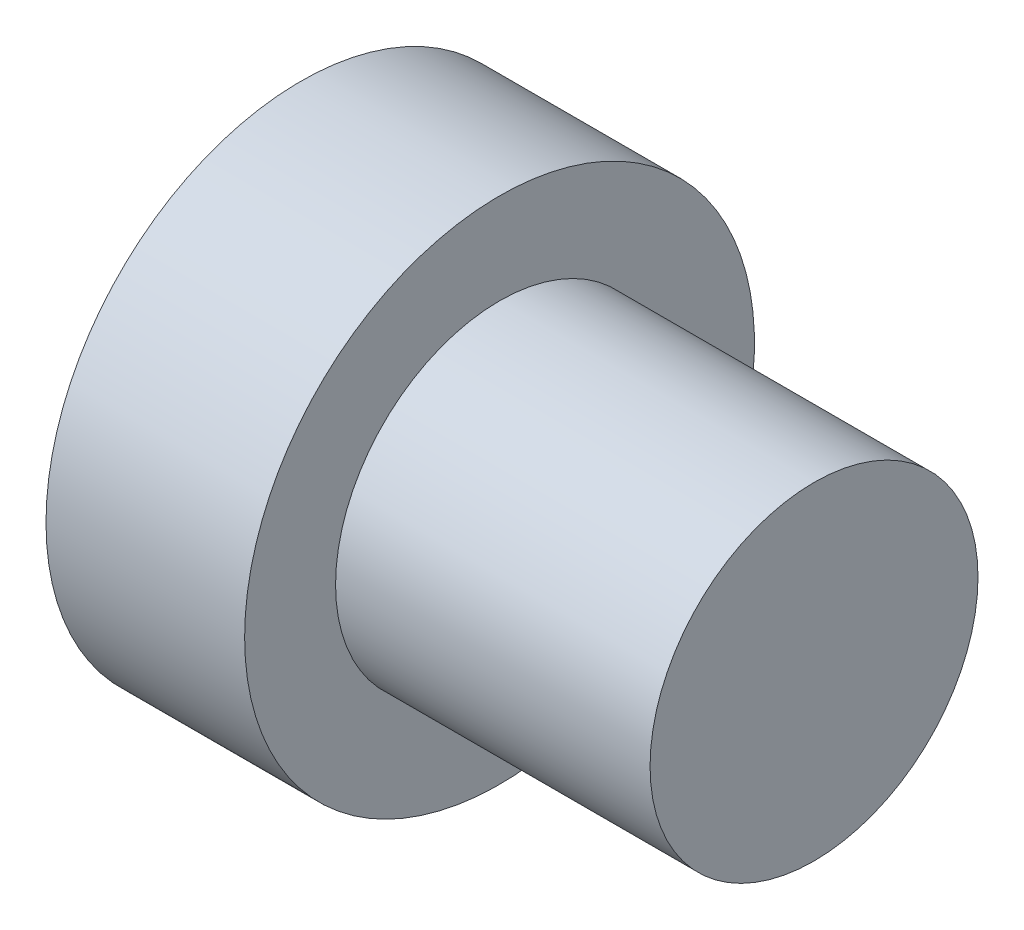
ISO-10303-21;
HEADER;
FILE_DESCRIPTION(('STEP AP214'),'2;1');
FILE_NAME('part.step','',(''),(''),'','','');
FILE_SCHEMA(('AUTOMOTIVE_DESIGN { 1 0 10303 214 1 1 1 1 }'));
ENDSEC;
DATA;
#1=APPLICATION_CONTEXT('core data for automotive mechanical design processes');
#2=APPLICATION_PROTOCOL_DEFINITION('international standard','automotive_design',2000,#1);
#3=PRODUCT_CONTEXT('',#1,'mechanical');
#4=PRODUCT('Part','Part','',(#3));
#5=PRODUCT_RELATED_PRODUCT_CATEGORY('part','',(#4));
#6=PRODUCT_DEFINITION_FORMATION('','',#4);
#7=PRODUCT_DEFINITION_CONTEXT('part definition',#1,'design');
#8=PRODUCT_DEFINITION('design','',#6,#7);
#9=PRODUCT_DEFINITION_SHAPE('','',#8);
#10=(LENGTH_UNIT() NAMED_UNIT(*) SI_UNIT(.MILLI.,.METRE.));
#11=(NAMED_UNIT(*) PLANE_ANGLE_UNIT() SI_UNIT($,.RADIAN.));
#12=(NAMED_UNIT(*) SI_UNIT($,.STERADIAN.) SOLID_ANGLE_UNIT());
#13=UNCERTAINTY_MEASURE_WITH_UNIT(LENGTH_MEASURE(1.E-05),#10,'distance_accuracy_value','');
#14=(GEOMETRIC_REPRESENTATION_CONTEXT(3) GLOBAL_UNCERTAINTY_ASSIGNED_CONTEXT((#13)) GLOBAL_UNIT_ASSIGNED_CONTEXT((#10,
#11,#12)) REPRESENTATION_CONTEXT('',''));
#15=CARTESIAN_POINT('',(0.,0.,0.));
#16=DIRECTION('',(0.,0.,1.));
#17=DIRECTION('',(1.,0.,0.));
#18=AXIS2_PLACEMENT_3D('',#15,#16,#17);
#19=CARTESIAN_POINT('',(9.5,0.,0.));
#20=DIRECTION('',(-1.,0.,0.));
#21=DIRECTION('',(0.,0.,1.));
#22=AXIS2_PLACEMENT_3D('',#19,#20,#21);
#23=PLANE('',#22);
#24=CARTESIAN_POINT('',(9.50000000000006,0.,0.));
#25=DIRECTION('',(-1.,0.,0.));
#26=DIRECTION('',(0.,0.,1.));
#27=AXIS2_PLACEMENT_3D('',#24,#25,#26);
#28=CIRCLE('',#27,4.953);
#29=CARTESIAN_POINT('',(9.50000000000006,0.,4.953));
#30=VERTEX_POINT('',#29);
#31=EDGE_CURVE('E10',#30,#30,#28,.T.);
#32=ORIENTED_EDGE('',*,*,#31,.F.);
#33=EDGE_LOOP('',(#32));
#34=FACE_BOUND('',#33,.T.);
#35=ADVANCED_FACE('F39',(#34),#23,.F.);
#36=CARTESIAN_POINT('',(-1000.,0.,0.));
#37=DIRECTION('',(-1.,0.,0.));
#38=DIRECTION('',(0.,0.,1.));
#39=AXIS2_PLACEMENT_3D('',#36,#37,#38);
#40=CYLINDRICAL_SURFACE('',#39,4.953);
#41=CARTESIAN_POINT('',(0.,0.,0.));
#42=DIRECTION('',(-1.,0.,0.));
#43=DIRECTION('',(0.,0.,1.));
#44=AXIS2_PLACEMENT_3D('',#41,#42,#43);
#45=CIRCLE('',#44,4.953);
#46=CARTESIAN_POINT('',(0.,0.,4.953));
#47=VERTEX_POINT('',#46);
#48=EDGE_CURVE('E44',#47,#47,#45,.T.);
#49=ORIENTED_EDGE('',*,*,#48,.F.);
#50=EDGE_LOOP('',(#49));
#51=FACE_BOUND('',#50,.T.);
#52=ORIENTED_EDGE('',*,*,#31,.T.);
#53=EDGE_LOOP('',(#52));
#54=FACE_BOUND('',#53,.T.);
#55=ADVANCED_FACE('F66',(#51,#54),#40,.T.);
#56=CARTESIAN_POINT('',(0.,4.953,0.));
#57=DIRECTION('',(-1.,0.,0.));
#58=DIRECTION('',(0.,0.,1.));
#59=AXIS2_PLACEMENT_3D('',#56,#57,#58);
#60=PLANE('',#59);
#61=CARTESIAN_POINT('',(0.,0.,0.));
#62=DIRECTION('',(-1.,0.,0.));
#63=DIRECTION('',(0.,0.,1.));
#64=AXIS2_PLACEMENT_3D('',#61,#62,#63);
#65=CIRCLE('',#64,7.7);
#66=CARTESIAN_POINT('',(0.,0.,7.7));
#67=VERTEX_POINT('',#66);
#68=EDGE_CURVE('E47',#67,#67,#65,.T.);
#69=ORIENTED_EDGE('',*,*,#68,.F.);
#70=EDGE_LOOP('',(#69));
#71=FACE_BOUND('',#70,.T.);
#72=ORIENTED_EDGE('',*,*,#48,.T.);
#73=EDGE_LOOP('',(#72));
#74=FACE_BOUND('',#73,.T.);
#75=ADVANCED_FACE('F61',(#71,#74),#60,.F.);
#76=CARTESIAN_POINT('',(-1000.,0.,0.));
#77=DIRECTION('',(-1.,0.,0.));
#78=DIRECTION('',(0.,0.,1.));
#79=AXIS2_PLACEMENT_3D('',#76,#77,#78);
#80=CYLINDRICAL_SURFACE('',#79,7.7);
#81=CARTESIAN_POINT('',(-6.00000000000001,0.,0.));
#82=DIRECTION('',(-1.,0.,0.));
#83=DIRECTION('',(0.,0.,1.));
#84=AXIS2_PLACEMENT_3D('',#81,#82,#83);
#85=CIRCLE('',#84,7.7);
#86=CARTESIAN_POINT('',(-6.00000000000001,0.,7.7));
#87=VERTEX_POINT('',#86);
#88=EDGE_CURVE('E52',#87,#87,#85,.T.);
#89=ORIENTED_EDGE('',*,*,#88,.F.);
#90=EDGE_LOOP('',(#89));
#91=FACE_BOUND('',#90,.T.);
#92=ORIENTED_EDGE('',*,*,#68,.T.);
#93=EDGE_LOOP('',(#92));
#94=FACE_BOUND('',#93,.T.);
#95=ADVANCED_FACE('F62',(#91,#94),#80,.T.);
#96=CARTESIAN_POINT('',(-6.,7.7,0.));
#97=DIRECTION('',(1.,0.,0.));
#98=DIRECTION('',(0.,0.,-1.));
#99=AXIS2_PLACEMENT_3D('',#96,#97,#98);
#100=PLANE('',#99);
#101=ORIENTED_EDGE('',*,*,#88,.T.);
#102=EDGE_LOOP('',(#101));
#103=FACE_BOUND('',#102,.T.);
#104=ADVANCED_FACE('F56',(#103),#100,.F.);
#105=CLOSED_SHELL('',(#35,#55,#75,#95,#104));
#106=MANIFOLD_SOLID_BREP('B2',#105);
#107=ADVANCED_BREP_SHAPE_REPRESENTATION('',(#18,#106),#14);
#108=SHAPE_DEFINITION_REPRESENTATION(#9,#107);
ENDSEC;
END-ISO-10303-21;
